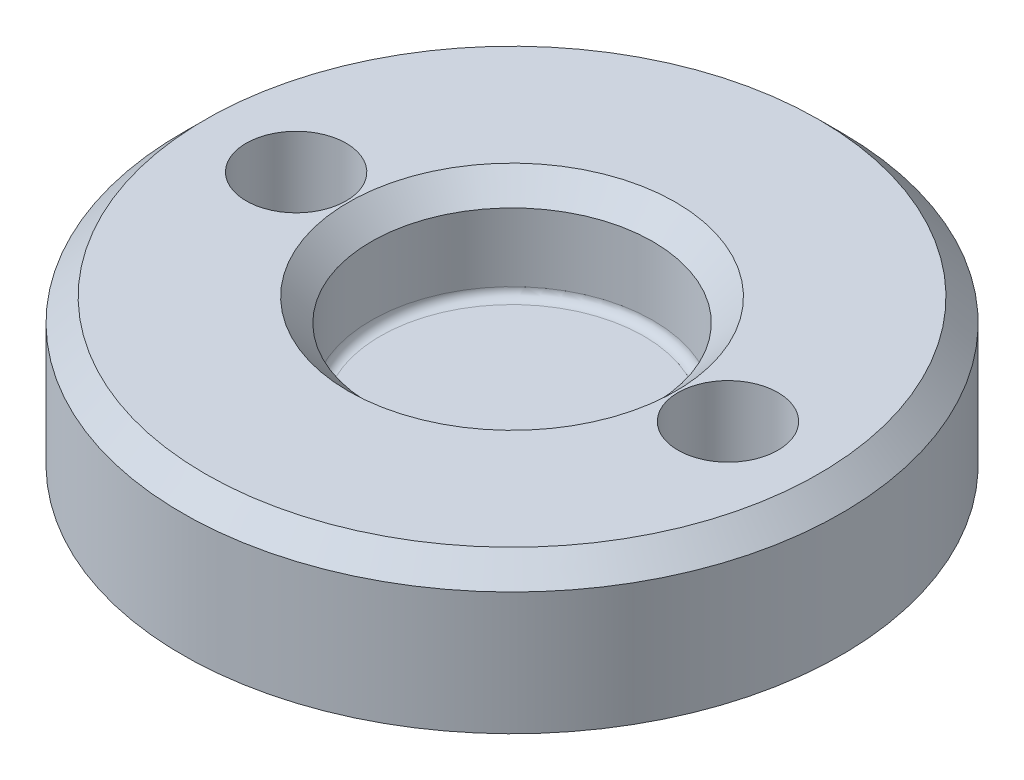
ISO-10303-21;
HEADER;
FILE_DESCRIPTION(('STEP AP214'),'2;1');
FILE_NAME('part.step','',(''),(''),'','','');
FILE_SCHEMA(('AUTOMOTIVE_DESIGN { 1 0 10303 214 1 1 1 1 }'));
ENDSEC;
DATA;
#1=APPLICATION_CONTEXT('core data for automotive mechanical design processes');
#2=APPLICATION_PROTOCOL_DEFINITION('international standard','automotive_design',2000,#1);
#3=PRODUCT_CONTEXT('',#1,'mechanical');
#4=PRODUCT('Part','Part','',(#3));
#5=PRODUCT_RELATED_PRODUCT_CATEGORY('part','',(#4));
#6=PRODUCT_DEFINITION_FORMATION('','',#4);
#7=PRODUCT_DEFINITION_CONTEXT('part definition',#1,'design');
#8=PRODUCT_DEFINITION('design','',#6,#7);
#9=PRODUCT_DEFINITION_SHAPE('','',#8);
#10=(LENGTH_UNIT() NAMED_UNIT(*) SI_UNIT(.MILLI.,.METRE.));
#11=(NAMED_UNIT(*) PLANE_ANGLE_UNIT() SI_UNIT($,.RADIAN.));
#12=(NAMED_UNIT(*) SI_UNIT($,.STERADIAN.) SOLID_ANGLE_UNIT());
#13=UNCERTAINTY_MEASURE_WITH_UNIT(LENGTH_MEASURE(1.E-05),#10,'distance_accuracy_value','');
#14=(GEOMETRIC_REPRESENTATION_CONTEXT(3) GLOBAL_UNCERTAINTY_ASSIGNED_CONTEXT((#13)) GLOBAL_UNIT_ASSIGNED_CONTEXT((#10,
#11,#12)) REPRESENTATION_CONTEXT('',''));
#15=CARTESIAN_POINT('',(0.,0.,0.));
#16=DIRECTION('',(0.,0.,1.));
#17=DIRECTION('',(1.,0.,0.));
#18=AXIS2_PLACEMENT_3D('',#15,#16,#17);
#19=CARTESIAN_POINT('',(0.,0.,0.));
#20=DIRECTION('',(0.,1.,0.));
#21=DIRECTION('',(0.,0.,1.));
#22=AXIS2_PLACEMENT_3D('',#19,#20,#21);
#23=PLANE('',#22);
#24=CARTESIAN_POINT('',(4.75,0.,0.));
#25=DIRECTION('',(0.,-1.,0.));
#26=DIRECTION('',(0.,0.,-1.));
#27=AXIS2_PLACEMENT_3D('',#24,#25,#26);
#28=CIRCLE('',#27,2.2);
#29=CARTESIAN_POINT('',(4.75,0.,-2.2));
#30=VERTEX_POINT('',#29);
#31=EDGE_CURVE('E79',#30,#30,#28,.T.);
#32=ORIENTED_EDGE('',*,*,#31,.F.);
#33=EDGE_LOOP('',(#32));
#34=FACE_BOUND('',#33,.T.);
#35=CARTESIAN_POINT('',(-4.75,0.,0.));
#36=DIRECTION('',(0.,-1.,0.));
#37=DIRECTION('',(0.,0.,-1.));
#38=AXIS2_PLACEMENT_3D('',#35,#36,#37);
#39=CIRCLE('',#38,2.2);
#40=CARTESIAN_POINT('',(-4.75,0.,-2.2));
#41=VERTEX_POINT('',#40);
#42=EDGE_CURVE('E59',#41,#41,#39,.T.);
#43=ORIENTED_EDGE('',*,*,#42,.F.);
#44=EDGE_LOOP('',(#43));
#45=FACE_BOUND('',#44,.T.);
#46=CARTESIAN_POINT('',(0.,0.,0.));
#47=DIRECTION('',(0.,-1.,0.));
#48=DIRECTION('',(0.,0.,-1.));
#49=AXIS2_PLACEMENT_3D('',#46,#47,#48);
#50=CIRCLE('',#49,7.25);
#51=CARTESIAN_POINT('',(0.,0.,-7.25));
#52=VERTEX_POINT('',#51);
#53=EDGE_CURVE('E64',#52,#52,#50,.T.);
#54=ORIENTED_EDGE('',*,*,#53,.T.);
#55=EDGE_LOOP('',(#54));
#56=FACE_BOUND('',#55,.T.);
#57=ADVANCED_FACE('F35',(#34,#45,#56),#23,.F.);
#58=CARTESIAN_POINT('',(0.,0.,0.));
#59=DIRECTION('',(0.,-1.,0.));
#60=DIRECTION('',(0.,0.,-1.));
#61=AXIS2_PLACEMENT_3D('',#58,#59,#60);
#62=CYLINDRICAL_SURFACE('',#61,7.25);
#63=CARTESIAN_POINT('',(0.,2.7,0.));
#64=DIRECTION('',(0.,-1.,0.));
#65=DIRECTION('',(0.,0.,-1.));
#66=AXIS2_PLACEMENT_3D('',#63,#64,#65);
#67=CIRCLE('',#66,7.25);
#68=CARTESIAN_POINT('',(0.,2.7,-7.25));
#69=VERTEX_POINT('',#68);
#70=EDGE_CURVE('E50',#69,#69,#67,.T.);
#71=ORIENTED_EDGE('',*,*,#70,.T.);
#72=EDGE_LOOP('',(#71));
#73=FACE_BOUND('',#72,.T.);
#74=ORIENTED_EDGE('',*,*,#53,.F.);
#75=EDGE_LOOP('',(#74));
#76=FACE_BOUND('',#75,.T.);
#77=ADVANCED_FACE('F87',(#73,#76),#62,.T.);
#78=CARTESIAN_POINT('',(-7.25,3.2,0.));
#79=DIRECTION('',(0.,-1.,0.));
#80=DIRECTION('',(0.,0.,-1.));
#81=AXIS2_PLACEMENT_3D('',#78,#79,#80);
#82=PLANE('',#81);
#83=CARTESIAN_POINT('',(0.,3.2,0.));
#84=DIRECTION('',(0.,-1.,0.));
#85=DIRECTION('',(0.,0.,-1.));
#86=AXIS2_PLACEMENT_3D('',#83,#84,#85);
#87=CIRCLE('',#86,6.75);
#88=CARTESIAN_POINT('',(0.,3.2,-6.75));
#89=VERTEX_POINT('',#88);
#90=EDGE_CURVE('E46',#89,#89,#87,.F.);
#91=ORIENTED_EDGE('',*,*,#90,.T.);
#92=EDGE_LOOP('',(#91));
#93=FACE_BOUND('',#92,.T.);
#94=CARTESIAN_POINT('',(4.75,3.2,0.));
#95=DIRECTION('',(0.,-1.,0.));
#96=DIRECTION('',(0.,0.,-1.));
#97=AXIS2_PLACEMENT_3D('',#94,#95,#96);
#98=CIRCLE('',#97,1.09999999999999);
#99=CARTESIAN_POINT('',(4.75,3.2,-1.09999999999999));
#100=VERTEX_POINT('',#99);
#101=EDGE_CURVE('E56',#100,#100,#98,.T.);
#102=ORIENTED_EDGE('',*,*,#101,.T.);
#103=EDGE_LOOP('',(#102));
#104=FACE_BOUND('',#103,.T.);
#105=CARTESIAN_POINT('',(-4.75,3.2,0.));
#106=DIRECTION('',(0.,-1.,0.));
#107=DIRECTION('',(0.,0.,-1.));
#108=AXIS2_PLACEMENT_3D('',#105,#106,#107);
#109=CIRCLE('',#108,1.09999999999999);
#110=CARTESIAN_POINT('',(-4.75,3.2,-1.09999999999999));
#111=VERTEX_POINT('',#110);
#112=EDGE_CURVE('E61',#111,#111,#109,.T.);
#113=ORIENTED_EDGE('',*,*,#112,.T.);
#114=EDGE_LOOP('',(#113));
#115=FACE_BOUND('',#114,.T.);
#116=CARTESIAN_POINT('',(0.,3.2,0.));
#117=DIRECTION('',(0.,-1.,0.));
#118=DIRECTION('',(0.,0.,-1.));
#119=AXIS2_PLACEMENT_3D('',#116,#117,#118);
#120=CIRCLE('',#119,3.6);
#121=CARTESIAN_POINT('',(0.,3.2,-3.6));
#122=VERTEX_POINT('',#121);
#123=EDGE_CURVE('E68',#122,#122,#120,.T.);
#124=ORIENTED_EDGE('',*,*,#123,.T.);
#125=EDGE_LOOP('',(#124));
#126=FACE_BOUND('',#125,.T.);
#127=ADVANCED_FACE('F94',(#93,#104,#115,#126),#82,.F.);
#128=CARTESIAN_POINT('',(0.,0.,0.));
#129=DIRECTION('',(0.,-1.,0.));
#130=DIRECTION('',(0.,0.,-1.));
#131=AXIS2_PLACEMENT_3D('',#128,#129,#130);
#132=CYLINDRICAL_SURFACE('',#131,3.1);
#133=CARTESIAN_POINT('',(0.,1.2,0.));
#134=DIRECTION('',(0.,-1.,0.));
#135=DIRECTION('',(0.,0.,-1.));
#136=AXIS2_PLACEMENT_3D('',#133,#134,#135);
#137=CIRCLE('',#136,3.1);
#138=CARTESIAN_POINT('',(0.,1.2,-3.1));
#139=VERTEX_POINT('',#138);
#140=EDGE_CURVE('E42',#139,#139,#137,.T.);
#141=ORIENTED_EDGE('',*,*,#140,.T.);
#142=EDGE_LOOP('',(#141));
#143=FACE_BOUND('',#142,.T.);
#144=CARTESIAN_POINT('',(0.,2.7,0.));
#145=DIRECTION('',(0.,-1.,0.));
#146=DIRECTION('',(0.,0.,-1.));
#147=AXIS2_PLACEMENT_3D('',#144,#145,#146);
#148=CIRCLE('',#147,3.1);
#149=CARTESIAN_POINT('',(0.,2.7,-3.1));
#150=VERTEX_POINT('',#149);
#151=EDGE_CURVE('E55',#150,#150,#148,.F.);
#152=ORIENTED_EDGE('',*,*,#151,.T.);
#153=EDGE_LOOP('',(#152));
#154=FACE_BOUND('',#153,.T.);
#155=ADVANCED_FACE('F100',(#143,#154),#132,.F.);
#156=CARTESIAN_POINT('',(-3.1,1.,0.));
#157=DIRECTION('',(0.,-1.,0.));
#158=DIRECTION('',(0.,0.,-1.));
#159=AXIS2_PLACEMENT_3D('',#156,#157,#158);
#160=PLANE('',#159);
#161=CARTESIAN_POINT('',(0.,1.,0.));
#162=DIRECTION('',(0.,-1.,0.));
#163=DIRECTION('',(0.,0.,-1.));
#164=AXIS2_PLACEMENT_3D('',#161,#162,#163);
#165=CIRCLE('',#164,2.9);
#166=CARTESIAN_POINT('',(0.,1.,-2.9));
#167=VERTEX_POINT('',#166);
#168=EDGE_CURVE('E10',#167,#167,#165,.F.);
#169=ORIENTED_EDGE('',*,*,#168,.T.);
#170=EDGE_LOOP('',(#169));
#171=FACE_BOUND('',#170,.T.);
#172=ADVANCED_FACE('F108',(#171),#160,.F.);
#173=CARTESIAN_POINT('',(0.,3.2,0.));
#174=DIRECTION('',(0.,1.,0.));
#175=DIRECTION('',(0.,0.,1.));
#176=AXIS2_PLACEMENT_3D('',#173,#174,#175);
#177=CONICAL_SURFACE('',#176,3.6,0.785398163397446);
#178=ORIENTED_EDGE('',*,*,#151,.F.);
#179=EDGE_LOOP('',(#178));
#180=FACE_BOUND('',#179,.T.);
#181=ORIENTED_EDGE('',*,*,#123,.F.);
#182=EDGE_LOOP('',(#181));
#183=FACE_BOUND('',#182,.T.);
#184=ADVANCED_FACE('F105',(#180,#183),#177,.F.);
#185=CARTESIAN_POINT('',(-4.75,0.,0.));
#186=DIRECTION('',(0.,-1.,0.));
#187=DIRECTION('',(0.,0.,-1.));
#188=AXIS2_PLACEMENT_3D('',#185,#186,#187);
#189=CYLINDRICAL_SURFACE('',#188,1.09999999999999);
#190=CARTESIAN_POINT('',(-4.75,1.1,0.));
#191=DIRECTION('',(0.,-1.,0.));
#192=DIRECTION('',(0.,0.,-1.));
#193=AXIS2_PLACEMENT_3D('',#190,#191,#192);
#194=CIRCLE('',#193,1.1);
#195=CARTESIAN_POINT('',(-4.75,1.1,-1.1));
#196=VERTEX_POINT('',#195);
#197=EDGE_CURVE('E65',#196,#196,#194,.T.);
#198=ORIENTED_EDGE('',*,*,#197,.T.);
#199=EDGE_LOOP('',(#198));
#200=FACE_BOUND('',#199,.T.);
#201=ORIENTED_EDGE('',*,*,#112,.F.);
#202=EDGE_LOOP('',(#201));
#203=FACE_BOUND('',#202,.T.);
#204=ADVANCED_FACE('F107',(#200,#203),#189,.F.);
#205=CARTESIAN_POINT('',(-4.75,0.,0.));
#206=DIRECTION('',(0.,-1.,0.));
#207=DIRECTION('',(0.,0.,-1.));
#208=AXIS2_PLACEMENT_3D('',#205,#206,#207);
#209=CONICAL_SURFACE('',#208,2.2,0.785398163397448);
#210=ORIENTED_EDGE('',*,*,#197,.F.);
#211=EDGE_LOOP('',(#210));
#212=FACE_BOUND('',#211,.T.);
#213=ORIENTED_EDGE('',*,*,#42,.T.);
#214=EDGE_LOOP('',(#213));
#215=FACE_BOUND('',#214,.T.);
#216=ADVANCED_FACE('F133',(#212,#215),#209,.F.);
#217=CARTESIAN_POINT('',(4.75,0.,0.));
#218=DIRECTION('',(0.,-1.,0.));
#219=DIRECTION('',(0.,0.,-1.));
#220=AXIS2_PLACEMENT_3D('',#217,#218,#219);
#221=CYLINDRICAL_SURFACE('',#220,1.09999999999999);
#222=CARTESIAN_POINT('',(4.75,1.1,0.));
#223=DIRECTION('',(0.,-1.,0.));
#224=DIRECTION('',(0.,0.,-1.));
#225=AXIS2_PLACEMENT_3D('',#222,#223,#224);
#226=CIRCLE('',#225,1.1);
#227=CARTESIAN_POINT('',(4.75,1.1,-1.1));
#228=VERTEX_POINT('',#227);
#229=EDGE_CURVE('E60',#228,#228,#226,.T.);
#230=ORIENTED_EDGE('',*,*,#229,.T.);
#231=EDGE_LOOP('',(#230));
#232=FACE_BOUND('',#231,.T.);
#233=ORIENTED_EDGE('',*,*,#101,.F.);
#234=EDGE_LOOP('',(#233));
#235=FACE_BOUND('',#234,.T.);
#236=ADVANCED_FACE('F118',(#232,#235),#221,.F.);
#237=CARTESIAN_POINT('',(4.75,0.,0.));
#238=DIRECTION('',(0.,-1.,0.));
#239=DIRECTION('',(0.,0.,-1.));
#240=AXIS2_PLACEMENT_3D('',#237,#238,#239);
#241=CONICAL_SURFACE('',#240,2.2,0.785398163397448);
#242=ORIENTED_EDGE('',*,*,#229,.F.);
#243=EDGE_LOOP('',(#242));
#244=FACE_BOUND('',#243,.T.);
#245=ORIENTED_EDGE('',*,*,#31,.T.);
#246=EDGE_LOOP('',(#245));
#247=FACE_BOUND('',#246,.T.);
#248=ADVANCED_FACE('F83',(#244,#247),#241,.F.);
#249=CARTESIAN_POINT('',(0.,2.7,0.));
#250=DIRECTION('',(0.,-1.,0.));
#251=DIRECTION('',(0.,0.,-1.));
#252=AXIS2_PLACEMENT_3D('',#249,#250,#251);
#253=CONICAL_SURFACE('',#252,7.25,0.785398163397449);
#254=ORIENTED_EDGE('',*,*,#90,.F.);
#255=EDGE_LOOP('',(#254));
#256=FACE_BOUND('',#255,.T.);
#257=ORIENTED_EDGE('',*,*,#70,.F.);
#258=EDGE_LOOP('',(#257));
#259=FACE_BOUND('',#258,.T.);
#260=ADVANCED_FACE('F110',(#256,#259),#253,.T.);
#261=CARTESIAN_POINT('',(0.,1.2,0.));
#262=DIRECTION('',(0.,-1.,0.));
#263=DIRECTION('',(0.,0.,-1.));
#264=AXIS2_PLACEMENT_3D('',#261,#262,#263);
#265=TOROIDAL_SURFACE('',#264,2.9,0.2);
#266=ORIENTED_EDGE('',*,*,#168,.F.);
#267=EDGE_LOOP('',(#266));
#268=FACE_BOUND('',#267,.T.);
#269=ORIENTED_EDGE('',*,*,#140,.F.);
#270=EDGE_LOOP('',(#269));
#271=FACE_BOUND('',#270,.T.);
#272=ADVANCED_FACE('F37',(#268,#271),#265,.F.);
#273=CLOSED_SHELL('',(#57,#77,#127,#155,#172,#184,#204,#216,#236,#248,#260,#272));
#274=MANIFOLD_SOLID_BREP('B2',#273);
#275=ADVANCED_BREP_SHAPE_REPRESENTATION('',(#18,#274),#14);
#276=SHAPE_DEFINITION_REPRESENTATION(#9,#275);
ENDSEC;
END-ISO-10303-21;
